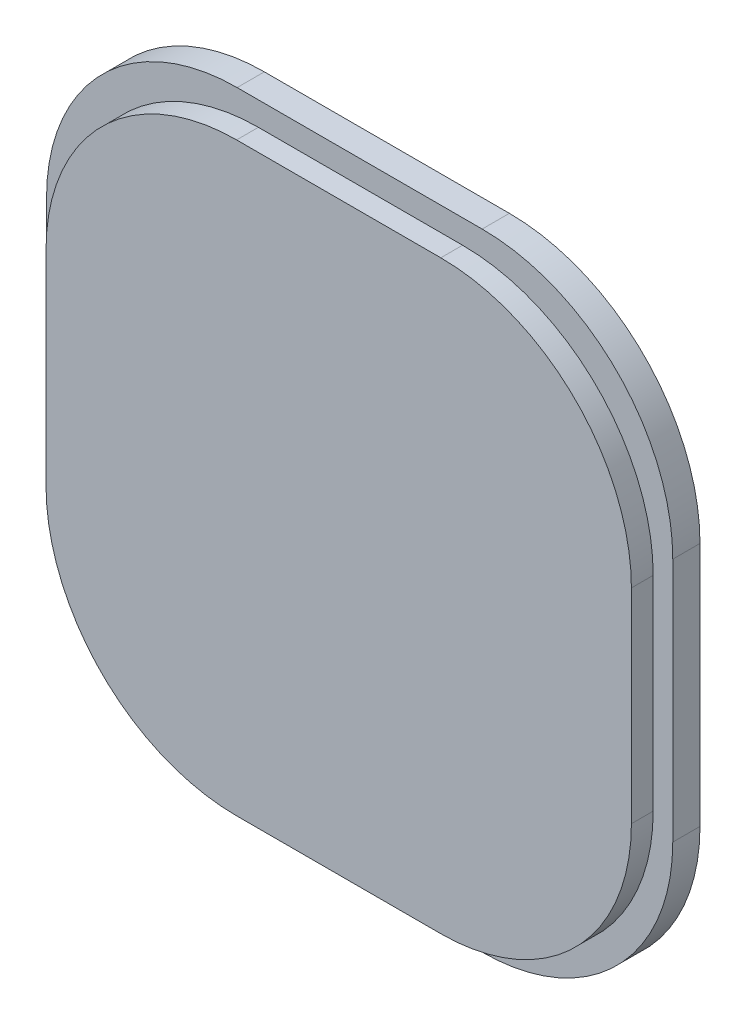
ISO-10303-21;
HEADER;
FILE_DESCRIPTION(('STEP AP214'),'2;1');
FILE_NAME('part.step','',(''),(''),'','','');
FILE_SCHEMA(('AUTOMOTIVE_DESIGN { 1 0 10303 214 1 1 1 1 }'));
ENDSEC;
DATA;
#1=APPLICATION_CONTEXT('core data for automotive mechanical design processes');
#2=APPLICATION_PROTOCOL_DEFINITION('international standard','automotive_design',2000,#1);
#3=PRODUCT_CONTEXT('',#1,'mechanical');
#4=PRODUCT('Part','Part','',(#3));
#5=PRODUCT_RELATED_PRODUCT_CATEGORY('part','',(#4));
#6=PRODUCT_DEFINITION_FORMATION('','',#4);
#7=PRODUCT_DEFINITION_CONTEXT('part definition',#1,'design');
#8=PRODUCT_DEFINITION('design','',#6,#7);
#9=PRODUCT_DEFINITION_SHAPE('','',#8);
#10=(LENGTH_UNIT() NAMED_UNIT(*) SI_UNIT(.MILLI.,.METRE.));
#11=(NAMED_UNIT(*) PLANE_ANGLE_UNIT() SI_UNIT($,.RADIAN.));
#12=(NAMED_UNIT(*) SI_UNIT($,.STERADIAN.) SOLID_ANGLE_UNIT());
#13=UNCERTAINTY_MEASURE_WITH_UNIT(LENGTH_MEASURE(1.E-05),#10,'distance_accuracy_value','');
#14=(GEOMETRIC_REPRESENTATION_CONTEXT(3) GLOBAL_UNCERTAINTY_ASSIGNED_CONTEXT((#13)) GLOBAL_UNIT_ASSIGNED_CONTEXT((#10,
#11,#12)) REPRESENTATION_CONTEXT('',''));
#15=CARTESIAN_POINT('',(0.,0.,0.));
#16=DIRECTION('',(0.,0.,1.));
#17=DIRECTION('',(1.,0.,0.));
#18=AXIS2_PLACEMENT_3D('',#15,#16,#17);
#19=CARTESIAN_POINT('',(-48.671389480953,10.3452257532573,1.));
#20=DIRECTION('',(0.,0.,-1.));
#21=DIRECTION('',(-1.,0.,0.));
#22=AXIS2_PLACEMENT_3D('',#19,#20,#21);
#23=CYLINDRICAL_SURFACE('',#22,7.);
#24=CARTESIAN_POINT('',(-48.671389480953,10.3452257532573,0.));
#25=DIRECTION('',(0.,0.,1.));
#26=DIRECTION('',(1.,0.,0.));
#27=AXIS2_PLACEMENT_3D('',#24,#25,#26);
#28=CIRCLE('',#27,7.);
#29=CARTESIAN_POINT('',(-48.671389480953,17.3452257532573,0.));
#30=VERTEX_POINT('',#29);
#31=CARTESIAN_POINT('',(-55.671389480953,10.3452257532573,0.));
#32=VERTEX_POINT('',#31);
#33=EDGE_CURVE('E182',#30,#32,#28,.T.);
#34=ORIENTED_EDGE('',*,*,#33,.T.);
#35=DIRECTION('',(0.,0.,-1.));
#36=VECTOR('',#35,1.);
#37=CARTESIAN_POINT('',(-55.671389480953,10.3452257532573,1.));
#38=LINE('',#37,#36);
#39=CARTESIAN_POINT('',(-55.671389480953,10.3452257532573,1.));
#40=VERTEX_POINT('',#39);
#41=EDGE_CURVE('E11',#40,#32,#38,.T.);
#42=ORIENTED_EDGE('',*,*,#41,.F.);
#43=CARTESIAN_POINT('',(-48.671389480953,10.3452257532573,1.));
#44=DIRECTION('',(0.,0.,1.));
#45=DIRECTION('',(1.,0.,0.));
#46=AXIS2_PLACEMENT_3D('',#43,#44,#45);
#47=CIRCLE('',#46,7.);
#48=CARTESIAN_POINT('',(-48.671389480953,17.3452257532573,1.));
#49=VERTEX_POINT('',#48);
#50=EDGE_CURVE('E193',#49,#40,#47,.T.);
#51=ORIENTED_EDGE('',*,*,#50,.F.);
#52=DIRECTION('',(0.,0.,-1.));
#53=VECTOR('',#52,1.);
#54=CARTESIAN_POINT('',(-48.671389480953,17.3452257532573,1.));
#55=LINE('',#54,#53);
#56=EDGE_CURVE('E221',#49,#30,#55,.T.);
#57=ORIENTED_EDGE('',*,*,#56,.T.);
#58=EDGE_LOOP('',(#34,#42,#51,#57));
#59=FACE_BOUND('',#58,.T.);
#60=ADVANCED_FACE('F45',(#59),#23,.T.);
#61=CARTESIAN_POINT('',(-55.671389480953,10.3452257532573,1.));
#62=DIRECTION('',(1.,0.,0.));
#63=DIRECTION('',(0.,0.,-1.));
#64=AXIS2_PLACEMENT_3D('',#61,#62,#63);
#65=PLANE('',#64);
#66=DIRECTION('',(0.,-1.,0.));
#67=VECTOR('',#66,1.);
#68=CARTESIAN_POINT('',(-55.671389480953,10.3452257532573,0.));
#69=LINE('',#68,#67);
#70=CARTESIAN_POINT('',(-55.671389480953,1.34522575325735,0.));
#71=VERTEX_POINT('',#70);
#72=EDGE_CURVE('E187',#32,#71,#69,.T.);
#73=ORIENTED_EDGE('',*,*,#72,.T.);
#74=DIRECTION('',(0.,0.,-1.));
#75=VECTOR('',#74,1.);
#76=CARTESIAN_POINT('',(-55.671389480953,1.34522575325735,1.));
#77=LINE('',#76,#75);
#78=CARTESIAN_POINT('',(-55.671389480953,1.34522575325735,1.));
#79=VERTEX_POINT('',#78);
#80=EDGE_CURVE('E53',#79,#71,#77,.T.);
#81=ORIENTED_EDGE('',*,*,#80,.F.);
#82=DIRECTION('',(0.,-1.,0.));
#83=VECTOR('',#82,1.);
#84=CARTESIAN_POINT('',(-55.671389480953,10.3452257532573,1.));
#85=LINE('',#84,#83);
#86=EDGE_CURVE('E197',#40,#79,#85,.T.);
#87=ORIENTED_EDGE('',*,*,#86,.F.);
#88=ORIENTED_EDGE('',*,*,#41,.T.);
#89=EDGE_LOOP('',(#73,#81,#87,#88));
#90=FACE_BOUND('',#89,.T.);
#91=ADVANCED_FACE('F293',(#90),#65,.F.);
#92=CARTESIAN_POINT('',(-48.671389480953,1.34522575325735,1.));
#93=DIRECTION('',(0.,0.,-1.));
#94=DIRECTION('',(-1.,0.,0.));
#95=AXIS2_PLACEMENT_3D('',#92,#93,#94);
#96=CYLINDRICAL_SURFACE('',#95,7.);
#97=CARTESIAN_POINT('',(-48.671389480953,1.34522575325735,0.));
#98=DIRECTION('',(0.,0.,1.));
#99=DIRECTION('',(1.,0.,0.));
#100=AXIS2_PLACEMENT_3D('',#97,#98,#99);
#101=CIRCLE('',#100,7.);
#102=CARTESIAN_POINT('',(-48.671389480953,-5.65477424674265,0.));
#103=VERTEX_POINT('',#102);
#104=EDGE_CURVE('E225',#71,#103,#101,.T.);
#105=ORIENTED_EDGE('',*,*,#104,.T.);
#106=DIRECTION('',(0.,0.,-1.));
#107=VECTOR('',#106,1.);
#108=CARTESIAN_POINT('',(-48.671389480953,-5.65477424674265,1.));
#109=LINE('',#108,#107);
#110=CARTESIAN_POINT('',(-48.671389480953,-5.65477424674265,1.));
#111=VERTEX_POINT('',#110);
#112=EDGE_CURVE('E261',#111,#103,#109,.T.);
#113=ORIENTED_EDGE('',*,*,#112,.F.);
#114=CARTESIAN_POINT('',(-48.671389480953,1.34522575325735,1.));
#115=DIRECTION('',(0.,0.,1.));
#116=DIRECTION('',(1.,0.,0.));
#117=AXIS2_PLACEMENT_3D('',#114,#115,#116);
#118=CIRCLE('',#117,7.);
#119=EDGE_CURVE('E201',#79,#111,#118,.T.);
#120=ORIENTED_EDGE('',*,*,#119,.F.);
#121=ORIENTED_EDGE('',*,*,#80,.T.);
#122=EDGE_LOOP('',(#105,#113,#120,#121));
#123=FACE_BOUND('',#122,.T.);
#124=ADVANCED_FACE('F270',(#123),#96,.T.);
#125=CARTESIAN_POINT('',(-48.671389480953,-5.65477424674265,1.));
#126=DIRECTION('',(0.,1.,0.));
#127=DIRECTION('',(0.,0.,1.));
#128=AXIS2_PLACEMENT_3D('',#125,#126,#127);
#129=PLANE('',#128);
#130=DIRECTION('',(1.,0.,0.));
#131=VECTOR('',#130,1.);
#132=CARTESIAN_POINT('',(-48.671389480953,-5.65477424674265,0.));
#133=LINE('',#132,#131);
#134=CARTESIAN_POINT('',(-39.671389480953,-5.65477424674265,0.));
#135=VERTEX_POINT('',#134);
#136=EDGE_CURVE('E228',#103,#135,#133,.T.);
#137=ORIENTED_EDGE('',*,*,#136,.T.);
#138=DIRECTION('',(0.,0.,-1.));
#139=VECTOR('',#138,1.);
#140=CARTESIAN_POINT('',(-39.671389480953,-5.65477424674265,1.));
#141=LINE('',#140,#139);
#142=CARTESIAN_POINT('',(-39.671389480953,-5.65477424674265,1.));
#143=VERTEX_POINT('',#142);
#144=EDGE_CURVE('E257',#143,#135,#141,.T.);
#145=ORIENTED_EDGE('',*,*,#144,.F.);
#146=DIRECTION('',(1.,0.,0.));
#147=VECTOR('',#146,1.);
#148=CARTESIAN_POINT('',(-48.671389480953,-5.65477424674265,1.));
#149=LINE('',#148,#147);
#150=EDGE_CURVE('E204',#111,#143,#149,.T.);
#151=ORIENTED_EDGE('',*,*,#150,.F.);
#152=ORIENTED_EDGE('',*,*,#112,.T.);
#153=EDGE_LOOP('',(#137,#145,#151,#152));
#154=FACE_BOUND('',#153,.T.);
#155=ADVANCED_FACE('F280',(#154),#129,.F.);
#156=CARTESIAN_POINT('',(-39.671389480953,1.34522575325735,1.));
#157=DIRECTION('',(0.,0.,-1.));
#158=DIRECTION('',(-1.,0.,0.));
#159=AXIS2_PLACEMENT_3D('',#156,#157,#158);
#160=CYLINDRICAL_SURFACE('',#159,7.);
#161=CARTESIAN_POINT('',(-39.671389480953,1.34522575325735,0.));
#162=DIRECTION('',(0.,0.,1.));
#163=DIRECTION('',(1.,0.,0.));
#164=AXIS2_PLACEMENT_3D('',#161,#162,#163);
#165=CIRCLE('',#164,7.);
#166=CARTESIAN_POINT('',(-32.671389480953,1.34522575325735,0.));
#167=VERTEX_POINT('',#166);
#168=EDGE_CURVE('E231',#135,#167,#165,.T.);
#169=ORIENTED_EDGE('',*,*,#168,.T.);
#170=DIRECTION('',(0.,0.,-1.));
#171=VECTOR('',#170,1.);
#172=CARTESIAN_POINT('',(-32.671389480953,1.34522575325735,1.));
#173=LINE('',#172,#171);
#174=CARTESIAN_POINT('',(-32.671389480953,1.34522575325735,1.));
#175=VERTEX_POINT('',#174);
#176=EDGE_CURVE('E254',#175,#167,#173,.T.);
#177=ORIENTED_EDGE('',*,*,#176,.F.);
#178=CARTESIAN_POINT('',(-39.671389480953,1.34522575325735,1.));
#179=DIRECTION('',(0.,0.,1.));
#180=DIRECTION('',(1.,0.,0.));
#181=AXIS2_PLACEMENT_3D('',#178,#179,#180);
#182=CIRCLE('',#181,7.);
#183=EDGE_CURVE('E207',#143,#175,#182,.T.);
#184=ORIENTED_EDGE('',*,*,#183,.F.);
#185=ORIENTED_EDGE('',*,*,#144,.T.);
#186=EDGE_LOOP('',(#169,#177,#184,#185));
#187=FACE_BOUND('',#186,.T.);
#188=ADVANCED_FACE('F284',(#187),#160,.T.);
#189=CARTESIAN_POINT('',(-32.671389480953,10.3452257532573,1.));
#190=DIRECTION('',(1.,0.,0.));
#191=DIRECTION('',(0.,0.,-1.));
#192=AXIS2_PLACEMENT_3D('',#189,#190,#191);
#193=PLANE('',#192);
#194=DIRECTION('',(0.,-1.,0.));
#195=VECTOR('',#194,1.);
#196=CARTESIAN_POINT('',(-32.671389480953,10.3452257532573,0.));
#197=LINE('',#196,#195);
#198=CARTESIAN_POINT('',(-32.671389480953,10.3452257532573,0.));
#199=VERTEX_POINT('',#198);
#200=EDGE_CURVE('E235',#199,#167,#197,.T.);
#201=ORIENTED_EDGE('',*,*,#200,.F.);
#202=DIRECTION('',(0.,0.,-1.));
#203=VECTOR('',#202,1.);
#204=CARTESIAN_POINT('',(-32.671389480953,10.3452257532573,1.));
#205=LINE('',#204,#203);
#206=CARTESIAN_POINT('',(-32.671389480953,10.3452257532573,1.));
#207=VERTEX_POINT('',#206);
#208=EDGE_CURVE('E251',#207,#199,#205,.T.);
#209=ORIENTED_EDGE('',*,*,#208,.F.);
#210=DIRECTION('',(0.,-1.,0.));
#211=VECTOR('',#210,1.);
#212=CARTESIAN_POINT('',(-32.671389480953,10.3452257532573,1.));
#213=LINE('',#212,#211);
#214=EDGE_CURVE('E210',#207,#175,#213,.T.);
#215=ORIENTED_EDGE('',*,*,#214,.T.);
#216=ORIENTED_EDGE('',*,*,#176,.T.);
#217=EDGE_LOOP('',(#201,#209,#215,#216));
#218=FACE_BOUND('',#217,.T.);
#219=ADVANCED_FACE('F303',(#218),#193,.T.);
#220=CARTESIAN_POINT('',(-39.671389480953,10.3452257532573,1.));
#221=DIRECTION('',(0.,0.,-1.));
#222=DIRECTION('',(-1.,0.,0.));
#223=AXIS2_PLACEMENT_3D('',#220,#221,#222);
#224=CYLINDRICAL_SURFACE('',#223,7.);
#225=CARTESIAN_POINT('',(-39.671389480953,10.3452257532573,0.));
#226=DIRECTION('',(0.,0.,-1.));
#227=DIRECTION('',(-1.,0.,0.));
#228=AXIS2_PLACEMENT_3D('',#225,#226,#227);
#229=CIRCLE('',#228,7.);
#230=CARTESIAN_POINT('',(-39.671389480953,17.3452257532573,0.));
#231=VERTEX_POINT('',#230);
#232=EDGE_CURVE('E239',#231,#199,#229,.T.);
#233=ORIENTED_EDGE('',*,*,#232,.F.);
#234=DIRECTION('',(0.,0.,-1.));
#235=VECTOR('',#234,1.);
#236=CARTESIAN_POINT('',(-39.671389480953,17.3452257532573,1.));
#237=LINE('',#236,#235);
#238=CARTESIAN_POINT('',(-39.671389480953,17.3452257532573,1.));
#239=VERTEX_POINT('',#238);
#240=EDGE_CURVE('E248',#239,#231,#237,.T.);
#241=ORIENTED_EDGE('',*,*,#240,.F.);
#242=CARTESIAN_POINT('',(-39.671389480953,10.3452257532573,1.));
#243=DIRECTION('',(0.,0.,-1.));
#244=DIRECTION('',(-1.,0.,0.));
#245=AXIS2_PLACEMENT_3D('',#242,#243,#244);
#246=CIRCLE('',#245,7.);
#247=EDGE_CURVE('E214',#239,#207,#246,.T.);
#248=ORIENTED_EDGE('',*,*,#247,.T.);
#249=ORIENTED_EDGE('',*,*,#208,.T.);
#250=EDGE_LOOP('',(#233,#241,#248,#249));
#251=FACE_BOUND('',#250,.T.);
#252=ADVANCED_FACE('F300',(#251),#224,.T.);
#253=CARTESIAN_POINT('',(-48.671389480953,17.3452257532573,1.));
#254=DIRECTION('',(0.,1.,0.));
#255=DIRECTION('',(0.,0.,1.));
#256=AXIS2_PLACEMENT_3D('',#253,#254,#255);
#257=PLANE('',#256);
#258=DIRECTION('',(1.,0.,0.));
#259=VECTOR('',#258,1.);
#260=CARTESIAN_POINT('',(-48.671389480953,17.3452257532573,0.));
#261=LINE('',#260,#259);
#262=EDGE_CURVE('E198',#30,#231,#261,.T.);
#263=ORIENTED_EDGE('',*,*,#262,.F.);
#264=ORIENTED_EDGE('',*,*,#56,.F.);
#265=DIRECTION('',(1.,0.,0.));
#266=VECTOR('',#265,1.);
#267=CARTESIAN_POINT('',(-48.671389480953,17.3452257532573,1.));
#268=LINE('',#267,#266);
#269=EDGE_CURVE('E218',#49,#239,#268,.T.);
#270=ORIENTED_EDGE('',*,*,#269,.T.);
#271=ORIENTED_EDGE('',*,*,#240,.T.);
#272=EDGE_LOOP('',(#263,#264,#270,#271));
#273=FACE_BOUND('',#272,.T.);
#274=ADVANCED_FACE('F297',(#273),#257,.T.);
#275=CARTESIAN_POINT('',(-48.671389480953,10.3452257532573,1.));
#276=DIRECTION('',(0.,0.,1.));
#277=DIRECTION('',(1.,0.,0.));
#278=AXIS2_PLACEMENT_3D('',#275,#276,#277);
#279=PLANE('',#278);
#280=CARTESIAN_POINT('',(-47.8905928880956,9.47110567931096,1.));
#281=DIRECTION('',(0.,0.,1.));
#282=DIRECTION('',(1.,0.,0.));
#283=AXIS2_PLACEMENT_3D('',#280,#281,#282);
#284=CIRCLE('',#283,7.);
#285=CARTESIAN_POINT('',(-47.8905928880956,16.471105679311,1.));
#286=VERTEX_POINT('',#285);
#287=CARTESIAN_POINT('',(-54.8905928880956,9.47110567931096,1.));
#288=VERTEX_POINT('',#287);
#289=EDGE_CURVE('E60',#286,#288,#284,.T.);
#290=ORIENTED_EDGE('',*,*,#289,.F.);
#291=DIRECTION('',(1.,0.,0.));
#292=VECTOR('',#291,1.);
#293=CARTESIAN_POINT('',(-47.8905928880956,16.471105679311,1.));
#294=LINE('',#293,#292);
#295=CARTESIAN_POINT('',(-40.3905928880956,16.471105679311,1.));
#296=VERTEX_POINT('',#295);
#297=EDGE_CURVE('E65',#286,#296,#294,.T.);
#298=ORIENTED_EDGE('',*,*,#297,.T.);
#299=CARTESIAN_POINT('',(-40.3905928880956,9.47110567931096,1.));
#300=DIRECTION('',(0.,0.,-1.));
#301=DIRECTION('',(-1.,0.,0.));
#302=AXIS2_PLACEMENT_3D('',#299,#300,#301);
#303=CIRCLE('',#302,7.);
#304=CARTESIAN_POINT('',(-33.3905928880956,9.47110567931096,1.));
#305=VERTEX_POINT('',#304);
#306=EDGE_CURVE('E510',#296,#305,#303,.T.);
#307=ORIENTED_EDGE('',*,*,#306,.T.);
#308=DIRECTION('',(0.,-1.,0.));
#309=VECTOR('',#308,1.);
#310=CARTESIAN_POINT('',(-33.3905928880956,9.47110567931096,1.));
#311=LINE('',#310,#309);
#312=CARTESIAN_POINT('',(-33.3905928880956,1.97110567931096,1.));
#313=VERTEX_POINT('',#312);
#314=EDGE_CURVE('E513',#305,#313,#311,.T.);
#315=ORIENTED_EDGE('',*,*,#314,.T.);
#316=CARTESIAN_POINT('',(-40.3905928880956,1.97110567931096,1.));
#317=DIRECTION('',(0.,0.,1.));
#318=DIRECTION('',(1.,0.,0.));
#319=AXIS2_PLACEMENT_3D('',#316,#317,#318);
#320=CIRCLE('',#319,7.);
#321=CARTESIAN_POINT('',(-40.3905928880956,-5.02889432068904,1.));
#322=VERTEX_POINT('',#321);
#323=EDGE_CURVE('E547',#322,#313,#320,.T.);
#324=ORIENTED_EDGE('',*,*,#323,.F.);
#325=DIRECTION('',(1.,0.,0.));
#326=VECTOR('',#325,1.);
#327=CARTESIAN_POINT('',(-47.8905928880956,-5.02889432068904,1.));
#328=LINE('',#327,#326);
#329=CARTESIAN_POINT('',(-47.8905928880956,-5.02889432068904,1.));
#330=VERTEX_POINT('',#329);
#331=EDGE_CURVE('E538',#330,#322,#328,.T.);
#332=ORIENTED_EDGE('',*,*,#331,.F.);
#333=CARTESIAN_POINT('',(-47.8905928880956,1.97110567931096,1.));
#334=DIRECTION('',(0.,0.,1.));
#335=DIRECTION('',(1.,0.,0.));
#336=AXIS2_PLACEMENT_3D('',#333,#334,#335);
#337=CIRCLE('',#336,7.);
#338=CARTESIAN_POINT('',(-54.8905928880956,1.97110567931096,1.));
#339=VERTEX_POINT('',#338);
#340=EDGE_CURVE('E541',#339,#330,#337,.T.);
#341=ORIENTED_EDGE('',*,*,#340,.F.);
#342=DIRECTION('',(0.,-1.,0.));
#343=VECTOR('',#342,1.);
#344=CARTESIAN_POINT('',(-54.8905928880956,9.47110567931096,1.));
#345=LINE('',#344,#343);
#346=EDGE_CURVE('E543',#288,#339,#345,.T.);
#347=ORIENTED_EDGE('',*,*,#346,.F.);
#348=EDGE_LOOP('',(#290,#298,#307,#315,#324,#332,#341,#347));
#349=FACE_BOUND('',#348,.T.);
#350=ORIENTED_EDGE('',*,*,#50,.T.);
#351=ORIENTED_EDGE('',*,*,#86,.T.);
#352=ORIENTED_EDGE('',*,*,#119,.T.);
#353=ORIENTED_EDGE('',*,*,#150,.T.);
#354=ORIENTED_EDGE('',*,*,#183,.T.);
#355=ORIENTED_EDGE('',*,*,#214,.F.);
#356=ORIENTED_EDGE('',*,*,#247,.F.);
#357=ORIENTED_EDGE('',*,*,#269,.F.);
#358=EDGE_LOOP('',(#350,#351,#352,#353,#354,#355,#356,#357));
#359=FACE_BOUND('',#358,.T.);
#360=ADVANCED_FACE('F288',(#349,#359),#279,.T.);
#361=CARTESIAN_POINT('',(-48.671389480953,10.3452257532573,0.));
#362=DIRECTION('',(0.,0.,1.));
#363=DIRECTION('',(1.,0.,0.));
#364=AXIS2_PLACEMENT_3D('',#361,#362,#363);
#365=PLANE('',#364);
#366=ORIENTED_EDGE('',*,*,#33,.F.);
#367=ORIENTED_EDGE('',*,*,#262,.T.);
#368=ORIENTED_EDGE('',*,*,#232,.T.);
#369=ORIENTED_EDGE('',*,*,#200,.T.);
#370=ORIENTED_EDGE('',*,*,#168,.F.);
#371=ORIENTED_EDGE('',*,*,#136,.F.);
#372=ORIENTED_EDGE('',*,*,#104,.F.);
#373=ORIENTED_EDGE('',*,*,#72,.F.);
#374=EDGE_LOOP('',(#366,#367,#368,#369,#370,#371,#372,#373));
#375=FACE_BOUND('',#374,.T.);
#376=ADVANCED_FACE('F276',(#375),#365,.F.);
#377=CARTESIAN_POINT('',(-47.8905928880956,9.47110567931096,1.8));
#378=DIRECTION('',(0.,0.,-1.));
#379=DIRECTION('',(-1.,0.,0.));
#380=AXIS2_PLACEMENT_3D('',#377,#378,#379);
#381=CYLINDRICAL_SURFACE('',#380,7.);
#382=ORIENTED_EDGE('',*,*,#289,.T.);
#383=DIRECTION('',(0.,0.,-1.));
#384=VECTOR('',#383,1.);
#385=CARTESIAN_POINT('',(-54.8905928880956,9.47110567931096,1.8));
#386=LINE('',#385,#384);
#387=CARTESIAN_POINT('',(-54.8905928880956,9.47110567931096,1.8));
#388=VERTEX_POINT('',#387);
#389=EDGE_CURVE('E162',#388,#288,#386,.T.);
#390=ORIENTED_EDGE('',*,*,#389,.F.);
#391=CARTESIAN_POINT('',(-47.8905928880956,9.47110567931096,1.8));
#392=DIRECTION('',(0.,0.,1.));
#393=DIRECTION('',(1.,0.,0.));
#394=AXIS2_PLACEMENT_3D('',#391,#392,#393);
#395=CIRCLE('',#394,7.);
#396=CARTESIAN_POINT('',(-47.8905928880956,16.471105679311,1.8));
#397=VERTEX_POINT('',#396);
#398=EDGE_CURVE('E169',#397,#388,#395,.T.);
#399=ORIENTED_EDGE('',*,*,#398,.F.);
#400=DIRECTION('',(0.,0.,-1.));
#401=VECTOR('',#400,1.);
#402=CARTESIAN_POINT('',(-47.8905928880956,16.471105679311,1.8));
#403=LINE('',#402,#401);
#404=EDGE_CURVE('E506',#397,#286,#403,.T.);
#405=ORIENTED_EDGE('',*,*,#404,.T.);
#406=EDGE_LOOP('',(#382,#390,#399,#405));
#407=FACE_BOUND('',#406,.T.);
#408=ADVANCED_FACE('F180',(#407),#381,.T.);
#409=CARTESIAN_POINT('',(-54.8905928880956,9.47110567931096,1.8));
#410=DIRECTION('',(1.,0.,0.));
#411=DIRECTION('',(0.,0.,-1.));
#412=AXIS2_PLACEMENT_3D('',#409,#410,#411);
#413=PLANE('',#412);
#414=ORIENTED_EDGE('',*,*,#346,.T.);
#415=DIRECTION('',(0.,0.,-1.));
#416=VECTOR('',#415,1.);
#417=CARTESIAN_POINT('',(-54.8905928880956,1.97110567931096,1.8));
#418=LINE('',#417,#416);
#419=CARTESIAN_POINT('',(-54.8905928880956,1.97110567931096,1.8));
#420=VERTEX_POINT('',#419);
#421=EDGE_CURVE('E164',#420,#339,#418,.T.);
#422=ORIENTED_EDGE('',*,*,#421,.F.);
#423=DIRECTION('',(0.,-1.,0.));
#424=VECTOR('',#423,1.);
#425=CARTESIAN_POINT('',(-54.8905928880956,9.47110567931096,1.8));
#426=LINE('',#425,#424);
#427=EDGE_CURVE('E157',#388,#420,#426,.T.);
#428=ORIENTED_EDGE('',*,*,#427,.F.);
#429=ORIENTED_EDGE('',*,*,#389,.T.);
#430=EDGE_LOOP('',(#414,#422,#428,#429));
#431=FACE_BOUND('',#430,.T.);
#432=ADVANCED_FACE('F160',(#431),#413,.F.);
#433=CARTESIAN_POINT('',(-47.8905928880956,1.97110567931096,1.8));
#434=DIRECTION('',(0.,0.,-1.));
#435=DIRECTION('',(-1.,0.,0.));
#436=AXIS2_PLACEMENT_3D('',#433,#434,#435);
#437=CYLINDRICAL_SURFACE('',#436,7.);
#438=ORIENTED_EDGE('',*,*,#340,.T.);
#439=DIRECTION('',(0.,0.,-1.));
#440=VECTOR('',#439,1.);
#441=CARTESIAN_POINT('',(-47.8905928880956,-5.02889432068904,1.8));
#442=LINE('',#441,#440);
#443=CARTESIAN_POINT('',(-47.8905928880956,-5.02889432068904,1.8));
#444=VERTEX_POINT('',#443);
#445=EDGE_CURVE('E189',#444,#330,#442,.T.);
#446=ORIENTED_EDGE('',*,*,#445,.F.);
#447=CARTESIAN_POINT('',(-47.8905928880956,1.97110567931096,1.8));
#448=DIRECTION('',(0.,0.,1.));
#449=DIRECTION('',(1.,0.,0.));
#450=AXIS2_PLACEMENT_3D('',#447,#448,#449);
#451=CIRCLE('',#450,7.);
#452=EDGE_CURVE('E168',#420,#444,#451,.T.);
#453=ORIENTED_EDGE('',*,*,#452,.F.);
#454=ORIENTED_EDGE('',*,*,#421,.T.);
#455=EDGE_LOOP('',(#438,#446,#453,#454));
#456=FACE_BOUND('',#455,.T.);
#457=ADVANCED_FACE('F388',(#456),#437,.T.);
#458=CARTESIAN_POINT('',(-47.8905928880956,-5.02889432068904,1.8));
#459=DIRECTION('',(0.,1.,0.));
#460=DIRECTION('',(0.,0.,1.));
#461=AXIS2_PLACEMENT_3D('',#458,#459,#460);
#462=PLANE('',#461);
#463=ORIENTED_EDGE('',*,*,#331,.T.);
#464=DIRECTION('',(0.,0.,-1.));
#465=VECTOR('',#464,1.);
#466=CARTESIAN_POINT('',(-40.3905928880956,-5.02889432068904,1.8));
#467=LINE('',#466,#465);
#468=CARTESIAN_POINT('',(-40.3905928880956,-5.02889432068904,1.8));
#469=VERTEX_POINT('',#468);
#470=EDGE_CURVE('E529',#469,#322,#467,.T.);
#471=ORIENTED_EDGE('',*,*,#470,.F.);
#472=DIRECTION('',(1.,0.,0.));
#473=VECTOR('',#472,1.);
#474=CARTESIAN_POINT('',(-47.8905928880956,-5.02889432068904,1.8));
#475=LINE('',#474,#473);
#476=EDGE_CURVE('E539',#444,#469,#475,.T.);
#477=ORIENTED_EDGE('',*,*,#476,.F.);
#478=ORIENTED_EDGE('',*,*,#445,.T.);
#479=EDGE_LOOP('',(#463,#471,#477,#478));
#480=FACE_BOUND('',#479,.T.);
#481=ADVANCED_FACE('F398',(#480),#462,.F.);
#482=CARTESIAN_POINT('',(-40.3905928880956,1.97110567931096,1.8));
#483=DIRECTION('',(0.,0.,-1.));
#484=DIRECTION('',(-1.,0.,0.));
#485=AXIS2_PLACEMENT_3D('',#482,#483,#484);
#486=CYLINDRICAL_SURFACE('',#485,7.);
#487=ORIENTED_EDGE('',*,*,#323,.T.);
#488=DIRECTION('',(0.,0.,-1.));
#489=VECTOR('',#488,1.);
#490=CARTESIAN_POINT('',(-33.3905928880956,1.97110567931096,1.8));
#491=LINE('',#490,#489);
#492=CARTESIAN_POINT('',(-33.3905928880956,1.97110567931096,1.8));
#493=VERTEX_POINT('',#492);
#494=EDGE_CURVE('E525',#493,#313,#491,.T.);
#495=ORIENTED_EDGE('',*,*,#494,.F.);
#496=CARTESIAN_POINT('',(-40.3905928880956,1.97110567931096,1.8));
#497=DIRECTION('',(0.,0.,1.));
#498=DIRECTION('',(1.,0.,0.));
#499=AXIS2_PLACEMENT_3D('',#496,#497,#498);
#500=CIRCLE('',#499,7.);
#501=EDGE_CURVE('E561',#469,#493,#500,.T.);
#502=ORIENTED_EDGE('',*,*,#501,.F.);
#503=ORIENTED_EDGE('',*,*,#470,.T.);
#504=EDGE_LOOP('',(#487,#495,#502,#503));
#505=FACE_BOUND('',#504,.T.);
#506=ADVANCED_FACE('F409',(#505),#486,.T.);
#507=CARTESIAN_POINT('',(-33.3905928880956,9.47110567931096,1.8));
#508=DIRECTION('',(1.,0.,0.));
#509=DIRECTION('',(0.,0.,-1.));
#510=AXIS2_PLACEMENT_3D('',#507,#508,#509);
#511=PLANE('',#510);
#512=ORIENTED_EDGE('',*,*,#314,.F.);
#513=DIRECTION('',(0.,0.,-1.));
#514=VECTOR('',#513,1.);
#515=CARTESIAN_POINT('',(-33.3905928880956,9.47110567931096,1.8));
#516=LINE('',#515,#514);
#517=CARTESIAN_POINT('',(-33.3905928880956,9.47110567931096,1.8));
#518=VERTEX_POINT('',#517);
#519=EDGE_CURVE('E521',#518,#305,#516,.T.);
#520=ORIENTED_EDGE('',*,*,#519,.F.);
#521=DIRECTION('',(0.,-1.,0.));
#522=VECTOR('',#521,1.);
#523=CARTESIAN_POINT('',(-33.3905928880956,9.47110567931096,1.8));
#524=LINE('',#523,#522);
#525=EDGE_CURVE('E559',#518,#493,#524,.T.);
#526=ORIENTED_EDGE('',*,*,#525,.T.);
#527=ORIENTED_EDGE('',*,*,#494,.T.);
#528=EDGE_LOOP('',(#512,#520,#526,#527));
#529=FACE_BOUND('',#528,.T.);
#530=ADVANCED_FACE('F420',(#529),#511,.T.);
#531=CARTESIAN_POINT('',(-40.3905928880956,9.47110567931096,1.8));
#532=DIRECTION('',(0.,0.,-1.));
#533=DIRECTION('',(-1.,0.,0.));
#534=AXIS2_PLACEMENT_3D('',#531,#532,#533);
#535=CYLINDRICAL_SURFACE('',#534,7.);
#536=ORIENTED_EDGE('',*,*,#306,.F.);
#537=DIRECTION('',(0.,0.,-1.));
#538=VECTOR('',#537,1.);
#539=CARTESIAN_POINT('',(-40.3905928880956,16.471105679311,1.8));
#540=LINE('',#539,#538);
#541=CARTESIAN_POINT('',(-40.3905928880956,16.471105679311,1.8));
#542=VERTEX_POINT('',#541);
#543=EDGE_CURVE('E507',#542,#296,#540,.T.);
#544=ORIENTED_EDGE('',*,*,#543,.F.);
#545=CARTESIAN_POINT('',(-40.3905928880956,9.47110567931096,1.8));
#546=DIRECTION('',(0.,0.,-1.));
#547=DIRECTION('',(-1.,0.,0.));
#548=AXIS2_PLACEMENT_3D('',#545,#546,#547);
#549=CIRCLE('',#548,7.);
#550=EDGE_CURVE('E566',#542,#518,#549,.T.);
#551=ORIENTED_EDGE('',*,*,#550,.T.);
#552=ORIENTED_EDGE('',*,*,#519,.T.);
#553=EDGE_LOOP('',(#536,#544,#551,#552));
#554=FACE_BOUND('',#553,.T.);
#555=ADVANCED_FACE('F431',(#554),#535,.T.);
#556=CARTESIAN_POINT('',(-47.8905928880956,16.471105679311,1.8));
#557=DIRECTION('',(0.,1.,0.));
#558=DIRECTION('',(0.,0.,1.));
#559=AXIS2_PLACEMENT_3D('',#556,#557,#558);
#560=PLANE('',#559);
#561=ORIENTED_EDGE('',*,*,#297,.F.);
#562=ORIENTED_EDGE('',*,*,#404,.F.);
#563=DIRECTION('',(1.,0.,0.));
#564=VECTOR('',#563,1.);
#565=CARTESIAN_POINT('',(-47.8905928880956,16.471105679311,1.8));
#566=LINE('',#565,#564);
#567=EDGE_CURVE('E176',#397,#542,#566,.T.);
#568=ORIENTED_EDGE('',*,*,#567,.T.);
#569=ORIENTED_EDGE('',*,*,#543,.T.);
#570=EDGE_LOOP('',(#561,#562,#568,#569));
#571=FACE_BOUND('',#570,.T.);
#572=ADVANCED_FACE('F442',(#571),#560,.T.);
#573=CARTESIAN_POINT('',(-47.8905928880956,9.47110567931096,1.8));
#574=DIRECTION('',(0.,0.,1.));
#575=DIRECTION('',(1.,0.,0.));
#576=AXIS2_PLACEMENT_3D('',#573,#574,#575);
#577=PLANE('',#576);
#578=ORIENTED_EDGE('',*,*,#398,.T.);
#579=ORIENTED_EDGE('',*,*,#427,.T.);
#580=ORIENTED_EDGE('',*,*,#452,.T.);
#581=ORIENTED_EDGE('',*,*,#476,.T.);
#582=ORIENTED_EDGE('',*,*,#501,.T.);
#583=ORIENTED_EDGE('',*,*,#525,.F.);
#584=ORIENTED_EDGE('',*,*,#550,.F.);
#585=ORIENTED_EDGE('',*,*,#567,.F.);
#586=EDGE_LOOP('',(#578,#579,#580,#581,#582,#583,#584,#585));
#587=FACE_BOUND('',#586,.T.);
#588=ADVANCED_FACE('F173',(#587),#577,.T.);
#589=CLOSED_SHELL('',(#60,#91,#124,#155,#188,#219,#252,#274,#360,#376,#408,#432,#457,#481,#506,
#530,#555,#572,#588));
#590=MANIFOLD_SOLID_BREP('B2',#589);
#591=ADVANCED_BREP_SHAPE_REPRESENTATION('',(#18,#590),#14);
#592=SHAPE_DEFINITION_REPRESENTATION(#9,#591);
ENDSEC;
END-ISO-10303-21;
